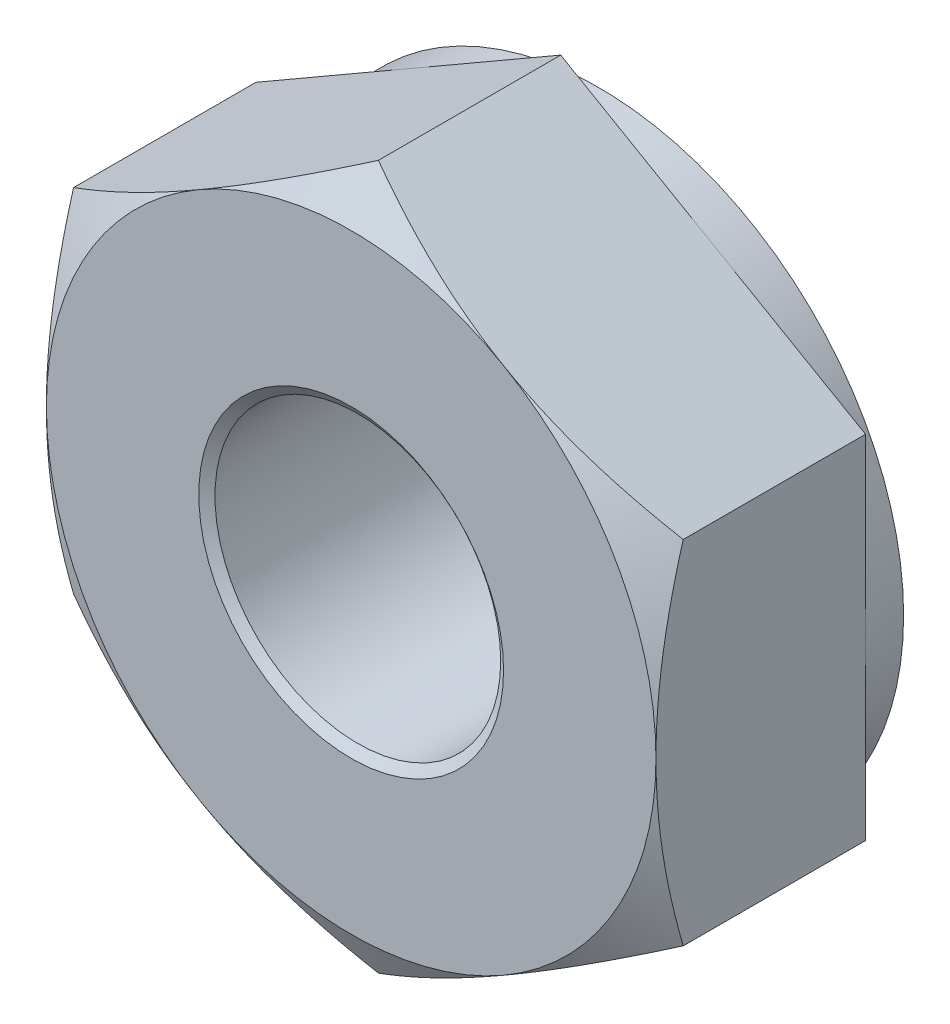
ISO-10303-21;
HEADER;
FILE_DESCRIPTION(('STEP AP214'),'2;1');
FILE_NAME('part.step','',(''),(''),'','','');
FILE_SCHEMA(('AUTOMOTIVE_DESIGN { 1 0 10303 214 1 1 1 1 }'));
ENDSEC;
DATA;
#1=APPLICATION_CONTEXT('core data for automotive mechanical design processes');
#2=APPLICATION_PROTOCOL_DEFINITION('international standard','automotive_design',2000,#1);
#3=PRODUCT_CONTEXT('',#1,'mechanical');
#4=PRODUCT('Part','Part','',(#3));
#5=PRODUCT_RELATED_PRODUCT_CATEGORY('part','',(#4));
#6=PRODUCT_DEFINITION_FORMATION('','',#4);
#7=PRODUCT_DEFINITION_CONTEXT('part definition',#1,'design');
#8=PRODUCT_DEFINITION('design','',#6,#7);
#9=PRODUCT_DEFINITION_SHAPE('','',#8);
#10=(LENGTH_UNIT() NAMED_UNIT(*) SI_UNIT(.MILLI.,.METRE.));
#11=(NAMED_UNIT(*) PLANE_ANGLE_UNIT() SI_UNIT($,.RADIAN.));
#12=(NAMED_UNIT(*) SI_UNIT($,.STERADIAN.) SOLID_ANGLE_UNIT());
#13=UNCERTAINTY_MEASURE_WITH_UNIT(LENGTH_MEASURE(1.E-05),#10,'distance_accuracy_value','');
#14=(GEOMETRIC_REPRESENTATION_CONTEXT(3) GLOBAL_UNCERTAINTY_ASSIGNED_CONTEXT((#13)) GLOBAL_UNIT_ASSIGNED_CONTEXT((#10,
#11,#12)) REPRESENTATION_CONTEXT('',''));
#15=CARTESIAN_POINT('',(0.,0.,0.));
#16=DIRECTION('',(0.,0.,1.));
#17=DIRECTION('',(1.,0.,0.));
#18=AXIS2_PLACEMENT_3D('',#15,#16,#17);
#19=CARTESIAN_POINT('',(0.,0.,-1.3));
#20=DIRECTION('',(0.,0.,1.));
#21=DIRECTION('',(1.,0.,0.));
#22=AXIS2_PLACEMENT_3D('',#19,#20,#21);
#23=CYLINDRICAL_SURFACE('',#22,0.75);
#24=CARTESIAN_POINT('',(0.,0.,-0.035010376910486));
#25=DIRECTION('',(0.,0.,1.));
#26=DIRECTION('',(1.,0.,0.));
#27=AXIS2_PLACEMENT_3D('',#24,#25,#26);
#28=CIRCLE('',#27,0.75);
#29=CARTESIAN_POINT('',(0.75,0.,-0.035010376910486));
#30=VERTEX_POINT('',#29);
#31=EDGE_CURVE('E153',#30,#30,#28,.F.);
#32=ORIENTED_EDGE('',*,*,#31,.F.);
#33=EDGE_LOOP('',(#32));
#34=FACE_BOUND('',#33,.T.);
#35=CARTESIAN_POINT('',(0.,0.,-1.23958962308951));
#36=DIRECTION('',(0.,0.,-1.));
#37=DIRECTION('',(-1.,0.,0.));
#38=AXIS2_PLACEMENT_3D('',#35,#36,#37);
#39=CIRCLE('',#38,0.75);
#40=CARTESIAN_POINT('',(-0.75,0.,-1.23958962308951));
#41=VERTEX_POINT('',#40);
#42=EDGE_CURVE('E41',#41,#41,#39,.F.);
#43=ORIENTED_EDGE('',*,*,#42,.F.);
#44=EDGE_LOOP('',(#43));
#45=FACE_BOUND('',#44,.T.);
#46=ADVANCED_FACE('F36',(#34,#45),#23,.F.);
#47=CARTESIAN_POINT('',(0.,1.84752086140681,-1.3));
#48=DIRECTION('',(-0.500000000000005,0.866025403784436,0.));
#49=DIRECTION('',(-0.866025403784436,-0.500000000000005,0.));
#50=AXIS2_PLACEMENT_3D('',#47,#48,#49);
#51=PLANE('',#50);
#52=DIRECTION('',(0.,0.,1.));
#53=VECTOR('',#52,1.);
#54=CARTESIAN_POINT('',(-1.6,0.923760430703396,-1.3));
#55=LINE('',#54,#53);
#56=CARTESIAN_POINT('',(-1.6,0.923760430703396,-1.1));
#57=VERTEX_POINT('',#56);
#58=CARTESIAN_POINT('',(-1.6,0.923760430703396,-0.142906235963271));
#59=VERTEX_POINT('',#58);
#60=EDGE_CURVE('E288',#57,#59,#55,.T.);
#61=ORIENTED_EDGE('',*,*,#60,.T.);
#62=CARTESIAN_POINT('',(-1.6002,0.923644960649558,-0.142972908879541));
#63=CARTESIAN_POINT('',(-1.52988631454261,0.964240585876096,-0.119523869351049));
#64=CARTESIAN_POINT('',(-1.45896568981644,1.00518662765285,-0.0981973588558098));
#65=CARTESIAN_POINT('',(-1.31589622208532,1.08778782336023,-0.0609706558641355));
#66=CARTESIAN_POINT('',(-1.24374483580214,1.12944444565323,-0.0450836346469221));
#67=CARTESIAN_POINT('',(-1.10033630057878,1.21224140206853,-0.0203517145647471));
#68=CARTESIAN_POINT('',(-1.02910122444319,1.25336899245115,-0.0113422364016098));
#69=CARTESIAN_POINT('',(-0.886295665767105,1.33581782019457,-0.000584271243996568));
#70=CARTESIAN_POINT('',(-0.814725702734544,1.37713875761731,0.00117312160481566));
#71=CARTESIAN_POINT('',(-0.680978543862275,1.45435771579556,-0.0024711730586314));
#72=CARTESIAN_POINT('',(-0.618781387401736,1.49026726082088,-0.00697805908761131));
#73=CARTESIAN_POINT('',(-0.494792313483936,1.5618523860239,-0.0212658761938095));
#74=CARTESIAN_POINT('',(-0.433000825294995,1.59752771836341,-0.0310516940962138));
#75=CARTESIAN_POINT('',(-0.308755841646638,1.66926059311825,-0.0555169113294962));
#76=CARTESIAN_POINT('',(-0.246318081755426,1.70530905059904,-0.0703000799228622));
#77=CARTESIAN_POINT('',(-0.122374128162252,1.77686812557049,-0.103852607783294));
#78=CARTESIAN_POINT('',(-0.0608663449577897,1.81237966076084,-0.122614076743969));
#79=CARTESIAN_POINT('',(0.000200000000006699,1.84763633146065,-0.142972908879548));
#80=B_SPLINE_CURVE_WITH_KNOTS('',3,(#62,#63,#64,#65,#66,#67,#68,#69,#70,#71,#72,#73,#74,#75,#76,
#77,#78,#79),.UNSPECIFIED.,.F.,.F.,(4,2,2,2,2,2,2,2,4),(0.,0.253628622662481,0.507867113505244,
0.755812447259193,1.00345320332839,1.21912891721902,1.43500463041922,1.65567058644229,
1.87590291418787),.UNSPECIFIED.);
#81=CARTESIAN_POINT('',(-0.800000000000007,1.3856406460551,0.));
#82=VERTEX_POINT('',#81);
#83=EDGE_CURVE('E60',#59,#82,#80,.T.);
#84=ORIENTED_EDGE('',*,*,#83,.T.);
#85=CARTESIAN_POINT('',(0.,1.84752086140681,-0.142906235963272));
#86=VERTEX_POINT('',#85);
#87=EDGE_CURVE('E167',#82,#86,#80,.T.);
#88=ORIENTED_EDGE('',*,*,#87,.T.);
#89=DIRECTION('',(0.,0.,1.));
#90=VECTOR('',#89,1.);
#91=CARTESIAN_POINT('',(0.,1.84752086140681,-1.3));
#92=LINE('',#91,#90);
#93=CARTESIAN_POINT('',(0.,1.84752086140681,-1.1));
#94=VERTEX_POINT('',#93);
#95=EDGE_CURVE('E276',#94,#86,#92,.T.);
#96=ORIENTED_EDGE('',*,*,#95,.F.);
#97=DIRECTION('',(-0.866025403784436,-0.500000000000005,0.));
#98=VECTOR('',#97,1.);
#99=CARTESIAN_POINT('',(0.,1.84752086140681,-1.1));
#100=LINE('',#99,#98);
#101=CARTESIAN_POINT('',(-0.800000000000007,1.3856406460551,-1.1));
#102=VERTEX_POINT('',#101);
#103=EDGE_CURVE('E264',#94,#102,#100,.T.);
#104=ORIENTED_EDGE('',*,*,#103,.T.);
#105=EDGE_CURVE('E260',#102,#57,#100,.T.);
#106=ORIENTED_EDGE('',*,*,#105,.T.);
#107=EDGE_LOOP('',(#61,#84,#88,#96,#104,#106));
#108=FACE_BOUND('',#107,.T.);
#109=ADVANCED_FACE('F38',(#108),#51,.T.);
#110=CARTESIAN_POINT('',(1.6,0.923760430703377,-1.3));
#111=DIRECTION('',(0.500000000000015,0.86602540378443,0.));
#112=DIRECTION('',(-0.86602540378443,0.500000000000015,0.));
#113=AXIS2_PLACEMENT_3D('',#110,#111,#112);
#114=PLANE('',#113);
#115=ORIENTED_EDGE('',*,*,#95,.T.);
#116=CARTESIAN_POINT('',(-0.000199999999993257,1.84763633146065,-0.142972908879548));
#117=CARTESIAN_POINT('',(0.0701136854573942,1.80704070623411,-0.119523869351055));
#118=CARTESIAN_POINT('',(0.141034310183565,1.76609466445736,-0.0981973588558151));
#119=CARTESIAN_POINT('',(0.284103777914683,1.68349346874998,-0.0609706558641393));
#120=CARTESIAN_POINT('',(0.356255164197871,1.64183684645697,-0.045083634646925));
#121=CARTESIAN_POINT('',(0.499663699421228,1.55903989004167,-0.0203517145647483));
#122=CARTESIAN_POINT('',(0.570898775556811,1.51791229965905,-0.0113422364016101));
#123=CARTESIAN_POINT('',(0.713704334232901,1.43546347191563,-0.000584271243995251));
#124=CARTESIAN_POINT('',(0.785274297265462,1.39414253449289,0.00117312160481776));
#125=CARTESIAN_POINT('',(0.91902145613773,1.31692357631464,-0.00247117305862782));
#126=CARTESIAN_POINT('',(0.981218612598269,1.28101403128931,-0.00697805908760694));
#127=CARTESIAN_POINT('',(1.10520768651607,1.2094289060863,-0.0212658761938038));
#128=CARTESIAN_POINT('',(1.16699917470501,1.17375357374678,-0.0310516940962073));
#129=CARTESIAN_POINT('',(1.29124415835336,1.10202069899194,-0.0555169113294886));
#130=CARTESIAN_POINT('',(1.35368191824457,1.06597224151115,-0.0703000799228539));
#131=CARTESIAN_POINT('',(1.47762587183775,0.994413166539704,-0.103852607783285));
#132=CARTESIAN_POINT('',(1.53913365504221,0.95890163134935,-0.122614076743959));
#133=CARTESIAN_POINT('',(1.6002,0.923644960649539,-0.142972908879537));
#134=B_SPLINE_CURVE_WITH_KNOTS('',3,(#116,#117,#118,#119,#120,#121,#122,#123,#124,#125,#126,
#127,#128,#129,#130,#131,#132,#133),.UNSPECIFIED.,.F.,.F.,(4,2,2,2,2,2,2,2,4),(0.,
0.253628622662482,0.507867113505247,0.755812447259198,1.0034532033284,1.21912891721903,
1.43500463041922,1.65567058644229,1.87590291418787),.UNSPECIFIED.);
#135=CARTESIAN_POINT('',(0.800000000000024,1.38564064605509,0.));
#136=VERTEX_POINT('',#135);
#137=EDGE_CURVE('E164',#86,#136,#134,.T.);
#138=ORIENTED_EDGE('',*,*,#137,.T.);
#139=CARTESIAN_POINT('',(1.6,0.923760430703413,-0.142906235963272));
#140=VERTEX_POINT('',#139);
#141=EDGE_CURVE('E147',#136,#140,#134,.T.);
#142=ORIENTED_EDGE('',*,*,#141,.T.);
#143=DIRECTION('',(0.,0.,1.));
#144=VECTOR('',#143,1.);
#145=CARTESIAN_POINT('',(1.6,0.923760430703377,-1.3));
#146=LINE('',#145,#144);
#147=CARTESIAN_POINT('',(1.6,0.923760430703377,-1.1));
#148=VERTEX_POINT('',#147);
#149=EDGE_CURVE('E163',#148,#140,#146,.T.);
#150=ORIENTED_EDGE('',*,*,#149,.F.);
#151=DIRECTION('',(-0.86602540378443,0.500000000000015,0.));
#152=VECTOR('',#151,1.);
#153=CARTESIAN_POINT('',(1.6,0.923760430703377,-1.1));
#154=LINE('',#153,#152);
#155=CARTESIAN_POINT('',(0.800000000000021,1.38564064605509,-1.1));
#156=VERTEX_POINT('',#155);
#157=EDGE_CURVE('E272',#148,#156,#154,.T.);
#158=ORIENTED_EDGE('',*,*,#157,.T.);
#159=EDGE_CURVE('E268',#156,#94,#154,.T.);
#160=ORIENTED_EDGE('',*,*,#159,.T.);
#161=EDGE_LOOP('',(#115,#138,#142,#150,#158,#160));
#162=FACE_BOUND('',#161,.T.);
#163=ADVANCED_FACE('F236',(#162),#114,.T.);
#164=CARTESIAN_POINT('',(1.6,0.923760430703377,-1.3));
#165=DIRECTION('',(-1.,0.,0.));
#166=DIRECTION('',(0.,0.,1.));
#167=AXIS2_PLACEMENT_3D('',#164,#165,#166);
#168=PLANE('',#167);
#169=CARTESIAN_POINT('',(1.6,-2.44994879598362,-0.765642728496288));
#170=CARTESIAN_POINT('',(1.6,-2.37969974814168,-0.731694508327946));
#171=CARTESIAN_POINT('',(1.6,-2.30928460837466,-0.698083761533568));
#172=CARTESIAN_POINT('',(1.6,-2.16803233911841,-0.631730058708314));
#173=CARTESIAN_POINT('',(1.6,-2.09719513913284,-0.598987252925758));
#174=CARTESIAN_POINT('',(1.6,-1.95462628673223,-0.534389785244733));
#175=CARTESIAN_POINT('',(1.6,-1.88289183551134,-0.502541278099917));
#176=CARTESIAN_POINT('',(1.6,-1.73883333903525,-0.440212234093472));
#177=CARTESIAN_POINT('',(1.6,-1.66650932474564,-0.409731625925834));
#178=CARTESIAN_POINT('',(1.6,-1.52025911131046,-0.350140376362859));
#179=CARTESIAN_POINT('',(1.6,-1.44632414246226,-0.321051139719735));
#180=CARTESIAN_POINT('',(1.6,-1.29758156645319,-0.26515069869728));
#181=CARTESIAN_POINT('',(1.6,-1.22277385663733,-0.23833976543631));
#182=CARTESIAN_POINT('',(1.6,-1.07232436571232,-0.18771774443223));
#183=CARTESIAN_POINT('',(1.6,-0.996684796742415,-0.163900149387134));
#184=CARTESIAN_POINT('',(1.6,-0.844324154022628,-0.120034982590478));
#185=CARTESIAN_POINT('',(1.6,-0.767603338043529,-0.0999865280833247));
#186=CARTESIAN_POINT('',(1.6,-0.61303688517199,-0.0646363619078617));
#187=CARTESIAN_POINT('',(1.6,-0.53519099934776,-0.0493357180986401));
#188=CARTESIAN_POINT('',(1.6,-0.378561259128079,-0.0245095306527841));
#189=CARTESIAN_POINT('',(1.6,-0.299777403903407,-0.0149839921220686));
#190=CARTESIAN_POINT('',(1.6,-0.142180170377933,-0.00255333229477597));
#191=CARTESIAN_POINT('',(1.6,-0.0633701971665815,0.000393701552476341));
#192=CARTESIAN_POINT('',(1.6,0.0941865075760858,-0.000479368384374313));
#193=CARTESIAN_POINT('',(1.6,0.172933250213972,-0.00429771555629688));
#194=CARTESIAN_POINT('',(1.6,0.36343777860252,-0.0213794511304649));
#195=CARTESIAN_POINT('',(1.6,0.474896382255862,-0.0379863535114706));
#196=CARTESIAN_POINT('',(1.6,0.695751445002718,-0.0817595954163157));
#197=CARTESIAN_POINT('',(1.6,0.805145318543937,-0.108938358499315));
#198=CARTESIAN_POINT('',(1.6,0.968869652923215,-0.155807156524301));
#199=CARTESIAN_POINT('',(1.6,1.02403724151599,-0.172685741626048));
#200=CARTESIAN_POINT('',(1.6,1.1337935397165,-0.208113667302645));
#201=CARTESIAN_POINT('',(1.6,1.18838261996593,-0.226661855504912));
#202=CARTESIAN_POINT('',(1.6,1.29675750604279,-0.265042326377563));
#203=CARTESIAN_POINT('',(1.6,1.35054610374999,-0.284866793658868));
#204=CARTESIAN_POINT('',(1.6,1.45770597270102,-0.325679318149276));
#205=CARTESIAN_POINT('',(1.6,1.51107706518846,-0.346667845641843));
#206=CARTESIAN_POINT('',(1.6,1.56425479594668,-0.3681236026167));
#207=B_SPLINE_CURVE_WITH_KNOTS('',3,(#169,#170,#171,#172,#173,#174,#175,#176,#177,#178,#179,
#180,#181,#182,#183,#184,#185,#186,#187,#188,#189,#190,#191,#192,#193,#194,#195,#196,#197,#198,
#199,#200,#201,#202,#203,#204,#205,#206),.UNSPECIFIED.,.F.,.F.,(4,2,2,2,2,2,2,2,2,2,2,2,2,2,2,2,
2,2,4),(0.,0.23406871701291,0.468177692239712,0.703626378583965,0.939062777139316,
1.17738868236876,1.41574290880728,1.65356966173646,1.89134064461683,2.12916506732233,
2.3669897002942,2.6032947424671,2.8395384376905,3.17691342355512,3.51468608047107,
3.6877412426225,3.86067786349693,4.03264108088362,4.20467428524161),.UNSPECIFIED.);
#208=CARTESIAN_POINT('',(1.59999999999998,-0.92376043070346,-0.142906235963272));
#209=VERTEX_POINT('',#208);
#210=CARTESIAN_POINT('',(1.6,0.,0.));
#211=VERTEX_POINT('',#210);
#212=EDGE_CURVE('E128',#209,#211,#207,.T.);
#213=ORIENTED_EDGE('',*,*,#212,.F.);
#214=DIRECTION('',(0.,0.,1.));
#215=VECTOR('',#214,1.);
#216=CARTESIAN_POINT('',(1.6,-0.923760430703444,-1.3));
#217=LINE('',#216,#215);
#218=CARTESIAN_POINT('',(1.6,-0.923760430703444,-1.1));
#219=VERTEX_POINT('',#218);
#220=EDGE_CURVE('E281',#219,#209,#217,.T.);
#221=ORIENTED_EDGE('',*,*,#220,.F.);
#222=DIRECTION('',(0.,-1.,0.));
#223=VECTOR('',#222,1.);
#224=CARTESIAN_POINT('',(1.6,0.923760430703377,-1.1));
#225=LINE('',#224,#223);
#226=CARTESIAN_POINT('',(1.6,0.,-1.1));
#227=VERTEX_POINT('',#226);
#228=EDGE_CURVE('E273',#227,#219,#225,.T.);
#229=ORIENTED_EDGE('',*,*,#228,.F.);
#230=EDGE_CURVE('E275',#148,#227,#225,.T.);
#231=ORIENTED_EDGE('',*,*,#230,.F.);
#232=ORIENTED_EDGE('',*,*,#149,.T.);
#233=EDGE_CURVE('E141',#211,#140,#207,.T.);
#234=ORIENTED_EDGE('',*,*,#233,.F.);
#235=EDGE_LOOP('',(#213,#221,#229,#231,#232,#234));
#236=FACE_BOUND('',#235,.T.);
#237=ADVANCED_FACE('F160',(#236),#168,.F.);
#238=CARTESIAN_POINT('',(0.,-1.84752086140681,-1.3));
#239=DIRECTION('',(0.499999999999983,-0.866025403784448,0.));
#240=DIRECTION('',(0.866025403784448,0.499999999999983,0.));
#241=AXIS2_PLACEMENT_3D('',#238,#239,#240);
#242=PLANE('',#241);
#243=ORIENTED_EDGE('',*,*,#220,.T.);
#244=CARTESIAN_POINT('',(1.6002,-0.923644960649606,-0.142972908879557));
#245=CARTESIAN_POINT('',(1.52988631454261,-0.964240585876143,-0.119523869351064));
#246=CARTESIAN_POINT('',(1.45896568981644,-1.00518662765289,-0.0981973588558248));
#247=CARTESIAN_POINT('',(1.31589622208532,-1.08778782336027,-0.0609706558641498));
#248=CARTESIAN_POINT('',(1.24374483580213,-1.12944444565327,-0.0450836346469359));
#249=CARTESIAN_POINT('',(1.10033630057877,-1.21224140206857,-0.0203517145647602));
#250=CARTESIAN_POINT('',(1.02910122444318,-1.25336899245119,-0.0113422364016226));
#251=CARTESIAN_POINT('',(0.886295665767088,-1.3358178201946,-0.000584271244008983));
#252=CARTESIAN_POINT('',(0.814725702734525,-1.37713875761734,0.00117312160480328));
#253=CARTESIAN_POINT('',(0.680978543862256,-1.45435771579559,-0.00247117305864346));
#254=CARTESIAN_POINT('',(0.61878138740172,-1.49026726082091,-0.00697805908762269));
#255=CARTESIAN_POINT('',(0.494792313483924,-1.56185238602392,-0.0212658761938192));
#256=CARTESIAN_POINT('',(0.433000825294985,-1.59752771836343,-0.0310516940962224));
#257=CARTESIAN_POINT('',(0.308755841646633,-1.66926059311826,-0.0555169113295023));
#258=CARTESIAN_POINT('',(0.246318081755423,-1.70530905059905,-0.0703000799228666));
#259=CARTESIAN_POINT('',(0.122374128162254,-1.77686812557049,-0.103852607783295));
#260=CARTESIAN_POINT('',(0.0608663449577939,-1.81237966076084,-0.122614076743968));
#261=CARTESIAN_POINT('',(-0.000200000000000235,-1.84763633146064,-0.142972908879545));
#262=B_SPLINE_CURVE_WITH_KNOTS('',3,(#244,#245,#246,#247,#248,#249,#250,#251,#252,#253,#254,
#255,#256,#257,#258,#259,#260,#261),.UNSPECIFIED.,.F.,.F.,(4,2,2,2,2,2,2,2,4),(0.,
0.253628622662484,0.507867113505251,0.755812447259204,1.00345320332841,1.21912891721902,
1.43500463041921,1.65567058644227,1.87590291418784),.UNSPECIFIED.);
#263=CARTESIAN_POINT('',(0.799999999999974,-1.38564064605512,0.));
#264=VERTEX_POINT('',#263);
#265=EDGE_CURVE('E135',#209,#264,#262,.T.);
#266=ORIENTED_EDGE('',*,*,#265,.T.);
#267=CARTESIAN_POINT('',(0.,-1.84752086140681,-0.142906235963272));
#268=VERTEX_POINT('',#267);
#269=EDGE_CURVE('E174',#264,#268,#262,.T.);
#270=ORIENTED_EDGE('',*,*,#269,.T.);
#271=DIRECTION('',(0.,0.,1.));
#272=VECTOR('',#271,1.);
#273=CARTESIAN_POINT('',(0.,-1.84752086140681,-1.3));
#274=LINE('',#273,#272);
#275=CARTESIAN_POINT('',(0.,-1.84752086140681,-1.1));
#276=VERTEX_POINT('',#275);
#277=EDGE_CURVE('E283',#276,#268,#274,.T.);
#278=ORIENTED_EDGE('',*,*,#277,.F.);
#279=DIRECTION('',(0.866025403784448,0.499999999999983,0.));
#280=VECTOR('',#279,1.);
#281=CARTESIAN_POINT('',(0.,-1.84752086140681,-1.1));
#282=LINE('',#281,#280);
#283=CARTESIAN_POINT('',(0.799999999999984,-1.38564064605514,-1.1));
#284=VERTEX_POINT('',#283);
#285=EDGE_CURVE('E265',#276,#284,#282,.T.);
#286=ORIENTED_EDGE('',*,*,#285,.T.);
#287=EDGE_CURVE('E269',#284,#219,#282,.T.);
#288=ORIENTED_EDGE('',*,*,#287,.T.);
#289=EDGE_LOOP('',(#243,#266,#270,#278,#286,#288));
#290=FACE_BOUND('',#289,.T.);
#291=ADVANCED_FACE('F217',(#290),#242,.T.);
#292=CARTESIAN_POINT('',(-1.6,-0.923760430703425,-1.3));
#293=DIRECTION('',(-0.499999999999992,-0.866025403784443,0.));
#294=DIRECTION('',(0.866025403784443,-0.499999999999992,0.));
#295=AXIS2_PLACEMENT_3D('',#292,#293,#294);
#296=PLANE('',#295);
#297=ORIENTED_EDGE('',*,*,#277,.T.);
#298=CARTESIAN_POINT('',(0.000199999999999687,-1.84763633146064,-0.142972908879545));
#299=CARTESIAN_POINT('',(-0.0701136854573889,-1.80704070623411,-0.119523869351053));
#300=CARTESIAN_POINT('',(-0.141034310183561,-1.76609466445736,-0.098197358855814));
#301=CARTESIAN_POINT('',(-0.284103777914681,-1.68349346874998,-0.0609706558641402));
#302=CARTESIAN_POINT('',(-0.35625516419787,-1.64183684645698,-0.045083634646927));
#303=CARTESIAN_POINT('',(-0.499663699421229,-1.55903989004168,-0.0203517145647526));
#304=CARTESIAN_POINT('',(-0.570898775556814,-1.51791229965906,-0.0113422364016157));
#305=CARTESIAN_POINT('',(-0.713704334232905,-1.43546347191565,-0.000584271244003197));
#306=CARTESIAN_POINT('',(-0.785274297265467,-1.3941425344929,0.00117312160480857));
#307=CARTESIAN_POINT('',(-0.919021456137735,-1.31692357631465,-0.0024711730586391));
#308=CARTESIAN_POINT('',(-0.981218612598273,-1.28101403128933,-0.00697805908761896));
#309=CARTESIAN_POINT('',(-1.10520768651607,-1.20942890608632,-0.0212658761938169));
#310=CARTESIAN_POINT('',(-1.16699917470501,-1.17375357374681,-0.0310516940962208));
#311=CARTESIAN_POINT('',(-1.29124415835336,-1.10202069899198,-0.0555169113295023));
#312=CARTESIAN_POINT('',(-1.35368191824457,-1.06597224151119,-0.0703000799228674));
#313=CARTESIAN_POINT('',(-1.47762587183775,-0.994413166539748,-0.103852607783298));
#314=CARTESIAN_POINT('',(-1.53913365504221,-0.958901631349396,-0.122614076743972));
#315=CARTESIAN_POINT('',(-1.6002,-0.923644960649587,-0.14297290887955));
#316=B_SPLINE_CURVE_WITH_KNOTS('',3,(#298,#299,#300,#301,#302,#303,#304,#305,#306,#307,#308,
#309,#310,#311,#312,#313,#314,#315),.UNSPECIFIED.,.F.,.F.,(4,2,2,2,2,2,2,2,4),(0.,
0.253628622662481,0.507867113505245,0.755812447259196,1.0034532033284,1.21912891721902,
1.43500463041921,1.65567058644227,1.87590291418784),.UNSPECIFIED.);
#317=CARTESIAN_POINT('',(-0.799999999999987,-1.38564064605511,0.));
#318=VERTEX_POINT('',#317);
#319=EDGE_CURVE('E211',#268,#318,#316,.T.);
#320=ORIENTED_EDGE('',*,*,#319,.T.);
#321=CARTESIAN_POINT('',(-1.6,-0.92376043070342,-0.142906235963272));
#322=VERTEX_POINT('',#321);
#323=EDGE_CURVE('E204',#318,#322,#316,.T.);
#324=ORIENTED_EDGE('',*,*,#323,.T.);
#325=DIRECTION('',(0.,0.,1.));
#326=VECTOR('',#325,1.);
#327=CARTESIAN_POINT('',(-1.6,-0.923760430703425,-1.3));
#328=LINE('',#327,#326);
#329=CARTESIAN_POINT('',(-1.6,-0.923760430703425,-1.1));
#330=VERTEX_POINT('',#329);
#331=EDGE_CURVE('E286',#330,#322,#328,.T.);
#332=ORIENTED_EDGE('',*,*,#331,.F.);
#333=DIRECTION('',(0.866025403784443,-0.499999999999992,0.));
#334=VECTOR('',#333,1.);
#335=CARTESIAN_POINT('',(-1.6,-0.923760430703425,-1.1));
#336=LINE('',#335,#334);
#337=CARTESIAN_POINT('',(-0.799999999999994,-1.38564064605512,-1.1));
#338=VERTEX_POINT('',#337);
#339=EDGE_CURVE('E255',#330,#338,#336,.T.);
#340=ORIENTED_EDGE('',*,*,#339,.T.);
#341=EDGE_CURVE('E261',#338,#276,#336,.T.);
#342=ORIENTED_EDGE('',*,*,#341,.T.);
#343=EDGE_LOOP('',(#297,#320,#324,#332,#340,#342));
#344=FACE_BOUND('',#343,.T.);
#345=ADVANCED_FACE('F213',(#344),#296,.T.);
#346=CARTESIAN_POINT('',(-1.6,0.923760430703396,-1.3));
#347=DIRECTION('',(-1.,0.,0.));
#348=DIRECTION('',(0.,0.,1.));
#349=AXIS2_PLACEMENT_3D('',#346,#347,#348);
#350=PLANE('',#349);
#351=ORIENTED_EDGE('',*,*,#331,.T.);
#352=CARTESIAN_POINT('',(-1.6,-2.44994879598359,-0.765642728496275));
#353=CARTESIAN_POINT('',(-1.6,-2.37969974814166,-0.731694508327933));
#354=CARTESIAN_POINT('',(-1.6,-2.30928460837463,-0.698083761533555));
#355=CARTESIAN_POINT('',(-1.6,-2.16803233911838,-0.631730058708302));
#356=CARTESIAN_POINT('',(-1.6,-2.09719513913281,-0.598987252925746));
#357=CARTESIAN_POINT('',(-1.6,-1.95462628673221,-0.534389785244721));
#358=CARTESIAN_POINT('',(-1.6,-1.88289183551132,-0.502541278099905));
#359=CARTESIAN_POINT('',(-1.6,-1.73883333903523,-0.440212234093461));
#360=CARTESIAN_POINT('',(-1.6,-1.66650932474562,-0.409731625925823));
#361=CARTESIAN_POINT('',(-1.6,-1.52025911131043,-0.350140376362849));
#362=CARTESIAN_POINT('',(-1.6,-1.44632414246224,-0.321051139719724));
#363=CARTESIAN_POINT('',(-1.6,-1.29758156645317,-0.265150698697271));
#364=CARTESIAN_POINT('',(-1.6,-1.22277385663731,-0.238339765436301));
#365=CARTESIAN_POINT('',(-1.6,-1.0723243657123,-0.187717744432223));
#366=CARTESIAN_POINT('',(-1.6,-0.996684796742395,-0.163900149387127));
#367=CARTESIAN_POINT('',(-1.6,-0.844324154022609,-0.120034982590472));
#368=CARTESIAN_POINT('',(-1.6,-0.767603338043511,-0.0999865280833183));
#369=CARTESIAN_POINT('',(-1.6,-0.613036885171972,-0.0646363619078563));
#370=CARTESIAN_POINT('',(-1.6,-0.535190999347743,-0.0493357180986351));
#371=CARTESIAN_POINT('',(-1.6,-0.378561259128062,-0.0245095306527799));
#372=CARTESIAN_POINT('',(-1.6,-0.299777403903391,-0.0149839921220649));
#373=CARTESIAN_POINT('',(-1.6,-0.142180170377918,-0.00255333229477318));
#374=CARTESIAN_POINT('',(-1.6,-0.0633701971665672,0.000393701552478633));
#375=CARTESIAN_POINT('',(-1.6,0.0941865075760992,-0.000479368384372849));
#376=CARTESIAN_POINT('',(-1.6,0.172933250213985,-0.00429771555629574));
#377=CARTESIAN_POINT('',(-1.6,0.363437778602533,-0.0213794511304645));
#378=CARTESIAN_POINT('',(-1.6,0.474896382255876,-0.0379863535114707));
#379=CARTESIAN_POINT('',(-1.6,0.695751445002733,-0.0817595954163172));
#380=CARTESIAN_POINT('',(-1.6,0.805145318543953,-0.108938358499317));
#381=CARTESIAN_POINT('',(-1.6,0.968869652923232,-0.155807156524304));
#382=CARTESIAN_POINT('',(-1.6,1.02403724151601,-0.172685741626052));
#383=CARTESIAN_POINT('',(-1.6,1.13379353971652,-0.208113667302649));
#384=CARTESIAN_POINT('',(-1.6,1.18838261996595,-0.226661855504916));
#385=CARTESIAN_POINT('',(-1.6,1.2967575060428,-0.265042326377568));
#386=CARTESIAN_POINT('',(-1.6,1.35054610375001,-0.284866793658873));
#387=CARTESIAN_POINT('',(-1.6,1.45770597270104,-0.325679318149282));
#388=CARTESIAN_POINT('',(-1.6,1.51107706518848,-0.346667845641849));
#389=CARTESIAN_POINT('',(-1.6,1.5642547959467,-0.368123602616706));
#390=B_SPLINE_CURVE_WITH_KNOTS('',3,(#352,#353,#354,#355,#356,#357,#358,#359,#360,#361,#362,
#363,#364,#365,#366,#367,#368,#369,#370,#371,#372,#373,#374,#375,#376,#377,#378,#379,#380,#381,
#382,#383,#384,#385,#386,#387,#388,#389),.UNSPECIFIED.,.F.,.F.,(4,2,2,2,2,2,2,2,2,2,2,2,2,2,2,2,
2,2,4),(0.,0.23406871701291,0.46817769223971,0.703626378583962,0.939062777139312,
1.17738868236875,1.41574290880727,1.65356966173645,1.89134064461682,2.12916506732232,
2.36698970029419,2.60329474246708,2.83953843769048,3.1769134235551,3.51468608047106,
3.68774124262249,3.86067786349693,4.03264108088361,4.2046742852416),.UNSPECIFIED.);
#391=CARTESIAN_POINT('',(-1.6,0.,0.));
#392=VERTEX_POINT('',#391);
#393=EDGE_CURVE('E212',#322,#392,#390,.T.);
#394=ORIENTED_EDGE('',*,*,#393,.T.);
#395=EDGE_CURVE('E152',#392,#59,#390,.T.);
#396=ORIENTED_EDGE('',*,*,#395,.T.);
#397=ORIENTED_EDGE('',*,*,#60,.F.);
#398=DIRECTION('',(0.,-1.,0.));
#399=VECTOR('',#398,1.);
#400=CARTESIAN_POINT('',(-1.6,0.923760430703396,-1.1));
#401=LINE('',#400,#399);
#402=CARTESIAN_POINT('',(-1.6,0.,-1.1));
#403=VERTEX_POINT('',#402);
#404=EDGE_CURVE('E295',#57,#403,#401,.T.);
#405=ORIENTED_EDGE('',*,*,#404,.T.);
#406=EDGE_CURVE('E293',#403,#330,#401,.T.);
#407=ORIENTED_EDGE('',*,*,#406,.T.);
#408=EDGE_LOOP('',(#351,#394,#396,#397,#405,#407));
#409=FACE_BOUND('',#408,.T.);
#410=ADVANCED_FACE('F216',(#409),#350,.T.);
#411=CARTESIAN_POINT('',(0.,1.84752086140681,0.));
#412=DIRECTION('',(0.,0.,-1.));
#413=DIRECTION('',(-1.,0.,0.));
#414=AXIS2_PLACEMENT_3D('',#411,#412,#413);
#415=PLANE('',#414);
#416=CARTESIAN_POINT('',(0.,0.,0.));
#417=DIRECTION('',(0.,0.,1.));
#418=DIRECTION('',(1.,0.,0.));
#419=AXIS2_PLACEMENT_3D('',#416,#417,#418);
#420=CIRCLE('',#419,0.8);
#421=CARTESIAN_POINT('',(0.8,0.,0.));
#422=VERTEX_POINT('',#421);
#423=EDGE_CURVE('E298',#422,#422,#420,.T.);
#424=ORIENTED_EDGE('',*,*,#423,.F.);
#425=EDGE_LOOP('',(#424));
#426=FACE_BOUND('',#425,.T.);
#427=CARTESIAN_POINT('',(0.,0.,0.));
#428=DIRECTION('',(0.,0.,-1.));
#429=DIRECTION('',(-1.,0.,0.));
#430=AXIS2_PLACEMENT_3D('',#427,#428,#429);
#431=CIRCLE('',#430,1.6);
#432=EDGE_CURVE('E48',#82,#392,#431,.F.);
#433=ORIENTED_EDGE('',*,*,#432,.T.);
#434=EDGE_CURVE('E12',#392,#318,#431,.F.);
#435=ORIENTED_EDGE('',*,*,#434,.T.);
#436=EDGE_CURVE('E46',#318,#264,#431,.F.);
#437=ORIENTED_EDGE('',*,*,#436,.T.);
#438=EDGE_CURVE('E132',#264,#211,#431,.F.);
#439=ORIENTED_EDGE('',*,*,#438,.T.);
#440=CARTESIAN_POINT('',(0.,0.,0.));
#441=DIRECTION('',(0.,0.,1.));
#442=DIRECTION('',(1.,0.,0.));
#443=AXIS2_PLACEMENT_3D('',#440,#441,#442);
#444=CIRCLE('',#443,1.6);
#445=EDGE_CURVE('E144',#211,#136,#444,.T.);
#446=ORIENTED_EDGE('',*,*,#445,.T.);
#447=EDGE_CURVE('E158',#136,#82,#431,.F.);
#448=ORIENTED_EDGE('',*,*,#447,.T.);
#449=EDGE_LOOP('',(#433,#435,#437,#439,#446,#448));
#450=FACE_BOUND('',#449,.T.);
#451=ADVANCED_FACE('F156',(#426,#450),#415,.F.);
#452=CARTESIAN_POINT('',(0.,1.84752086140681,-1.3));
#453=DIRECTION('',(0.,0.,-1.));
#454=DIRECTION('',(-1.,0.,0.));
#455=AXIS2_PLACEMENT_3D('',#452,#453,#454);
#456=PLANE('',#455);
#457=CARTESIAN_POINT('',(0.,0.,-1.3));
#458=DIRECTION('',(0.,0.,-1.));
#459=DIRECTION('',(-1.,0.,0.));
#460=AXIS2_PLACEMENT_3D('',#457,#458,#459);
#461=CIRCLE('',#460,0.800000000000002);
#462=CARTESIAN_POINT('',(-0.800000000000002,0.,-1.3));
#463=VERTEX_POINT('',#462);
#464=EDGE_CURVE('E299',#463,#463,#461,.F.);
#465=ORIENTED_EDGE('',*,*,#464,.T.);
#466=EDGE_LOOP('',(#465));
#467=FACE_BOUND('',#466,.T.);
#468=CARTESIAN_POINT('',(0.,0.,-1.3));
#469=DIRECTION('',(0.,0.,-1.));
#470=DIRECTION('',(-1.,0.,0.));
#471=AXIS2_PLACEMENT_3D('',#468,#469,#470);
#472=CIRCLE('',#471,1.6);
#473=CARTESIAN_POINT('',(-1.6,0.,-1.3));
#474=VERTEX_POINT('',#473);
#475=EDGE_CURVE('E279',#474,#474,#472,.F.);
#476=ORIENTED_EDGE('',*,*,#475,.F.);
#477=EDGE_LOOP('',(#476));
#478=FACE_BOUND('',#477,.T.);
#479=ADVANCED_FACE('F226',(#467,#478),#456,.T.);
#480=CARTESIAN_POINT('',(0.,11.8475208614068,-1.1));
#481=DIRECTION('',(0.,0.,-1.));
#482=DIRECTION('',(-1.,0.,0.));
#483=AXIS2_PLACEMENT_3D('',#480,#481,#482);
#484=PLANE('',#483);
#485=ORIENTED_EDGE('',*,*,#230,.T.);
#486=CARTESIAN_POINT('',(0.,0.,-1.1));
#487=DIRECTION('',(0.,0.,1.));
#488=DIRECTION('',(1.,0.,0.));
#489=AXIS2_PLACEMENT_3D('',#486,#487,#488);
#490=CIRCLE('',#489,1.6);
#491=EDGE_CURVE('E252',#227,#156,#490,.T.);
#492=ORIENTED_EDGE('',*,*,#491,.T.);
#493=ORIENTED_EDGE('',*,*,#157,.F.);
#494=EDGE_LOOP('',(#485,#492,#493));
#495=FACE_BOUND('',#494,.T.);
#496=ADVANCED_FACE('F243',(#495),#484,.T.);
#497=ORIENTED_EDGE('',*,*,#228,.T.);
#498=ORIENTED_EDGE('',*,*,#287,.F.);
#499=EDGE_CURVE('E257',#284,#227,#490,.T.);
#500=ORIENTED_EDGE('',*,*,#499,.T.);
#501=EDGE_LOOP('',(#497,#498,#500));
#502=FACE_BOUND('',#501,.T.);
#503=ADVANCED_FACE('F445',(#502),#484,.T.);
#504=EDGE_CURVE('E256',#156,#102,#490,.T.);
#505=ORIENTED_EDGE('',*,*,#504,.T.);
#506=ORIENTED_EDGE('',*,*,#103,.F.);
#507=ORIENTED_EDGE('',*,*,#159,.F.);
#508=EDGE_LOOP('',(#505,#506,#507));
#509=FACE_BOUND('',#508,.T.);
#510=ADVANCED_FACE('F436',(#509),#484,.T.);
#511=ORIENTED_EDGE('',*,*,#341,.F.);
#512=EDGE_CURVE('E509',#338,#284,#490,.T.);
#513=ORIENTED_EDGE('',*,*,#512,.T.);
#514=ORIENTED_EDGE('',*,*,#285,.F.);
#515=EDGE_LOOP('',(#511,#513,#514));
#516=FACE_BOUND('',#515,.T.);
#517=ADVANCED_FACE('F427',(#516),#484,.T.);
#518=EDGE_CURVE('E523',#102,#403,#490,.T.);
#519=ORIENTED_EDGE('',*,*,#518,.T.);
#520=ORIENTED_EDGE('',*,*,#404,.F.);
#521=ORIENTED_EDGE('',*,*,#105,.F.);
#522=EDGE_LOOP('',(#519,#520,#521));
#523=FACE_BOUND('',#522,.T.);
#524=ADVANCED_FACE('F411',(#523),#484,.T.);
#525=CARTESIAN_POINT('',(0.,0.,0.));
#526=DIRECTION('',(0.,0.,1.));
#527=DIRECTION('',(1.,0.,0.));
#528=AXIS2_PLACEMENT_3D('',#525,#526,#527);
#529=CYLINDRICAL_SURFACE('',#528,1.6);
#530=ORIENTED_EDGE('',*,*,#475,.T.);
#531=EDGE_LOOP('',(#530));
#532=FACE_BOUND('',#531,.T.);
#533=ORIENTED_EDGE('',*,*,#504,.F.);
#534=ORIENTED_EDGE('',*,*,#491,.F.);
#535=ORIENTED_EDGE('',*,*,#499,.F.);
#536=ORIENTED_EDGE('',*,*,#512,.F.);
#537=EDGE_CURVE('E525',#403,#338,#490,.T.);
#538=ORIENTED_EDGE('',*,*,#537,.F.);
#539=ORIENTED_EDGE('',*,*,#518,.F.);
#540=EDGE_LOOP('',(#533,#534,#535,#536,#538,#539));
#541=FACE_BOUND('',#540,.T.);
#542=ADVANCED_FACE('F241',(#532,#541),#529,.T.);
#543=ORIENTED_EDGE('',*,*,#406,.F.);
#544=ORIENTED_EDGE('',*,*,#537,.T.);
#545=ORIENTED_EDGE('',*,*,#339,.F.);
#546=EDGE_LOOP('',(#543,#544,#545));
#547=FACE_BOUND('',#546,.T.);
#548=ADVANCED_FACE('F194',(#547),#484,.T.);
#549=CARTESIAN_POINT('',(0.,0.,0.));
#550=DIRECTION('',(0.,0.,-1.));
#551=DIRECTION('',(-1.,0.,0.));
#552=AXIS2_PLACEMENT_3D('',#549,#550,#551);
#553=CONICAL_SURFACE('',#552,1.6,1.04719755119659);
#554=ORIENTED_EDGE('',*,*,#395,.F.);
#555=ORIENTED_EDGE('',*,*,#432,.F.);
#556=ORIENTED_EDGE('',*,*,#83,.F.);
#557=EDGE_LOOP('',(#554,#555,#556));
#558=FACE_BOUND('',#557,.T.);
#559=ADVANCED_FACE('F373',(#558),#553,.T.);
#560=ORIENTED_EDGE('',*,*,#447,.F.);
#561=ORIENTED_EDGE('',*,*,#137,.F.);
#562=ORIENTED_EDGE('',*,*,#87,.F.);
#563=EDGE_LOOP('',(#560,#561,#562));
#564=FACE_BOUND('',#563,.T.);
#565=ADVANCED_FACE('F192',(#564),#553,.T.);
#566=ORIENTED_EDGE('',*,*,#445,.F.);
#567=ORIENTED_EDGE('',*,*,#233,.T.);
#568=ORIENTED_EDGE('',*,*,#141,.F.);
#569=EDGE_LOOP('',(#566,#567,#568));
#570=FACE_BOUND('',#569,.T.);
#571=ADVANCED_FACE('F145',(#570),#553,.T.);
#572=ORIENTED_EDGE('',*,*,#212,.T.);
#573=ORIENTED_EDGE('',*,*,#438,.F.);
#574=ORIENTED_EDGE('',*,*,#265,.F.);
#575=EDGE_LOOP('',(#572,#573,#574));
#576=FACE_BOUND('',#575,.T.);
#577=ADVANCED_FACE('F130',(#576),#553,.T.);
#578=ORIENTED_EDGE('',*,*,#436,.F.);
#579=ORIENTED_EDGE('',*,*,#319,.F.);
#580=ORIENTED_EDGE('',*,*,#269,.F.);
#581=EDGE_LOOP('',(#578,#579,#580));
#582=FACE_BOUND('',#581,.T.);
#583=ADVANCED_FACE('F191',(#582),#553,.T.);
#584=ORIENTED_EDGE('',*,*,#434,.F.);
#585=ORIENTED_EDGE('',*,*,#393,.F.);
#586=ORIENTED_EDGE('',*,*,#323,.F.);
#587=EDGE_LOOP('',(#584,#585,#586));
#588=FACE_BOUND('',#587,.T.);
#589=ADVANCED_FACE('F185',(#588),#553,.T.);
#590=CARTESIAN_POINT('',(0.,0.,-0.0385114146015351));
#591=DIRECTION('',(0.,0.,1.));
#592=DIRECTION('',(1.,0.,0.));
#593=AXIS2_PLACEMENT_3D('',#590,#591,#592);
#594=CONICAL_SURFACE('',#593,0.745,0.95993108859683);
#595=ORIENTED_EDGE('',*,*,#423,.T.);
#596=EDGE_LOOP('',(#595));
#597=FACE_BOUND('',#596,.T.);
#598=ORIENTED_EDGE('',*,*,#31,.T.);
#599=EDGE_LOOP('',(#598));
#600=FACE_BOUND('',#599,.T.);
#601=ADVANCED_FACE('F190',(#597,#600),#594,.F.);
#602=CARTESIAN_POINT('',(0.,0.,-1.2746));
#603=DIRECTION('',(0.,0.,-1.));
#604=DIRECTION('',(-1.,0.,0.));
#605=AXIS2_PLACEMENT_3D('',#602,#603,#604);
#606=CONICAL_SURFACE('',#605,0.800000000000002,0.959931088596886);
#607=CARTESIAN_POINT('',(0.,0.,-1.2746));
#608=DIRECTION('',(0.,0.,1.));
#609=DIRECTION('',(1.,0.,0.));
#610=AXIS2_PLACEMENT_3D('',#607,#608,#609);
#611=CIRCLE('',#610,0.800000000000002);
#612=CARTESIAN_POINT('',(0.800000000000002,0.,-1.2746));
#613=VERTEX_POINT('',#612);
#614=EDGE_CURVE('E301',#613,#613,#611,.T.);
#615=ORIENTED_EDGE('',*,*,#614,.F.);
#616=EDGE_LOOP('',(#615));
#617=FACE_BOUND('',#616,.T.);
#618=ORIENTED_EDGE('',*,*,#42,.T.);
#619=EDGE_LOOP('',(#618));
#620=FACE_BOUND('',#619,.T.);
#621=ADVANCED_FACE('F314',(#617,#620),#606,.F.);
#622=CARTESIAN_POINT('',(0.,0.,-25.0375057290932));
#623=DIRECTION('',(0.,0.,1.));
#624=DIRECTION('',(1.,0.,0.));
#625=AXIS2_PLACEMENT_3D('',#622,#623,#624);
#626=CYLINDRICAL_SURFACE('',#625,0.800000000000002);
#627=ORIENTED_EDGE('',*,*,#464,.F.);
#628=EDGE_LOOP('',(#627));
#629=FACE_BOUND('',#628,.T.);
#630=ORIENTED_EDGE('',*,*,#614,.T.);
#631=EDGE_LOOP('',(#630));
#632=FACE_BOUND('',#631,.T.);
#633=ADVANCED_FACE('F318',(#629,#632),#626,.F.);
#634=CLOSED_SHELL('',(#46,#109,#163,#237,#291,#345,#410,#451,#479,#496,#503,#510,#517,#524,#542,
#548,#559,#565,#571,#577,#583,#589,#601,#621,#633));
#635=MANIFOLD_SOLID_BREP('B2',#634);
#636=ADVANCED_BREP_SHAPE_REPRESENTATION('',(#18,#635),#14);
#637=SHAPE_DEFINITION_REPRESENTATION(#9,#636);
ENDSEC;
END-ISO-10303-21;
